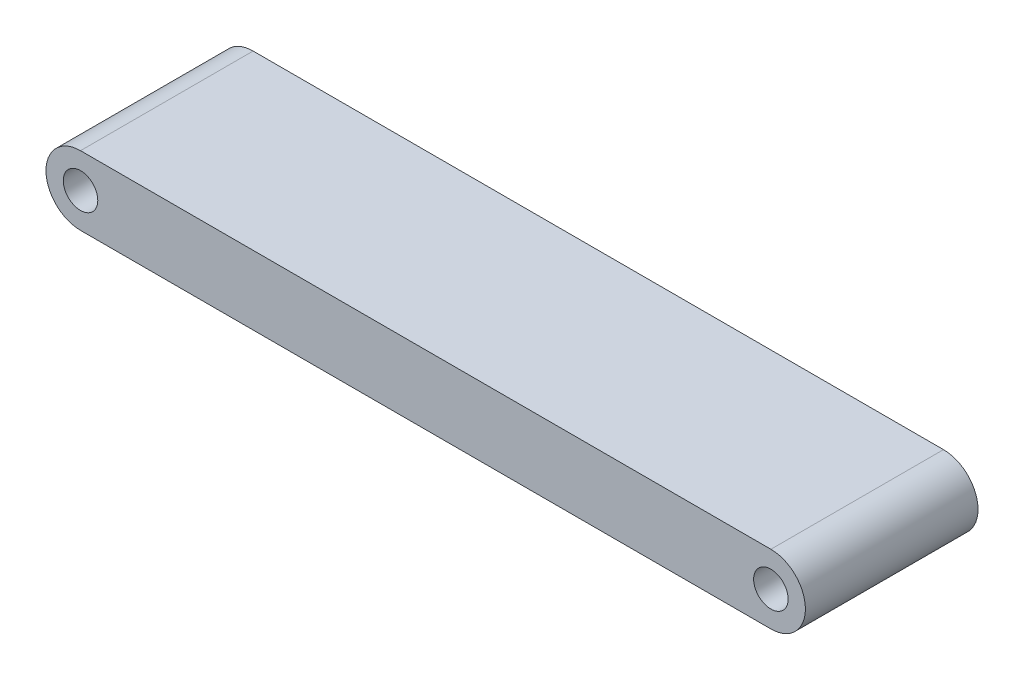
ISO-10303-21;
HEADER;
FILE_DESCRIPTION(('STEP AP214'),'2;1');
FILE_NAME('part.step','',(''),(''),'','','');
FILE_SCHEMA(('AUTOMOTIVE_DESIGN { 1 0 10303 214 1 1 1 1 }'));
ENDSEC;
DATA;
#1=APPLICATION_CONTEXT('core data for automotive mechanical design processes');
#2=APPLICATION_PROTOCOL_DEFINITION('international standard','automotive_design',2000,#1);
#3=PRODUCT_CONTEXT('',#1,'mechanical');
#4=PRODUCT('Part','Part','',(#3));
#5=PRODUCT_RELATED_PRODUCT_CATEGORY('part','',(#4));
#6=PRODUCT_DEFINITION_FORMATION('','',#4);
#7=PRODUCT_DEFINITION_CONTEXT('part definition',#1,'design');
#8=PRODUCT_DEFINITION('design','',#6,#7);
#9=PRODUCT_DEFINITION_SHAPE('','',#8);
#10=(LENGTH_UNIT() NAMED_UNIT(*) SI_UNIT(.MILLI.,.METRE.));
#11=(NAMED_UNIT(*) PLANE_ANGLE_UNIT() SI_UNIT($,.RADIAN.));
#12=(NAMED_UNIT(*) SI_UNIT($,.STERADIAN.) SOLID_ANGLE_UNIT());
#13=UNCERTAINTY_MEASURE_WITH_UNIT(LENGTH_MEASURE(1.E-05),#10,'distance_accuracy_value','');
#14=(GEOMETRIC_REPRESENTATION_CONTEXT(3) GLOBAL_UNCERTAINTY_ASSIGNED_CONTEXT((#13)) GLOBAL_UNIT_ASSIGNED_CONTEXT((#10,
#11,#12)) REPRESENTATION_CONTEXT('',''));
#15=CARTESIAN_POINT('',(0.,0.,0.));
#16=DIRECTION('',(0.,0.,1.));
#17=DIRECTION('',(1.,0.,0.));
#18=AXIS2_PLACEMENT_3D('',#15,#16,#17);
#19=CARTESIAN_POINT('',(2000.,0.,1000.));
#20=DIRECTION('',(0.,0.,-1.));
#21=DIRECTION('',(-1.,0.,0.));
#22=AXIS2_PLACEMENT_3D('',#19,#20,#21);
#23=CYLINDRICAL_SURFACE('',#22,200.);
#24=CARTESIAN_POINT('',(2000.,0.,0.));
#25=DIRECTION('',(0.,0.,1.));
#26=DIRECTION('',(1.,0.,0.));
#27=AXIS2_PLACEMENT_3D('',#24,#25,#26);
#28=CIRCLE('',#27,200.);
#29=CARTESIAN_POINT('',(2000.,-200.,0.));
#30=VERTEX_POINT('',#29);
#31=CARTESIAN_POINT('',(2000.,200.,0.));
#32=VERTEX_POINT('',#31);
#33=EDGE_CURVE('E117',#30,#32,#28,.T.);
#34=ORIENTED_EDGE('',*,*,#33,.T.);
#35=DIRECTION('',(0.,0.,-1.));
#36=VECTOR('',#35,1.);
#37=CARTESIAN_POINT('',(2000.,200.,1000.));
#38=LINE('',#37,#36);
#39=CARTESIAN_POINT('',(2000.,200.,1000.));
#40=VERTEX_POINT('',#39);
#41=EDGE_CURVE('E11',#40,#32,#38,.T.);
#42=ORIENTED_EDGE('',*,*,#41,.F.);
#43=CARTESIAN_POINT('',(2000.,0.,1000.));
#44=DIRECTION('',(0.,0.,1.));
#45=DIRECTION('',(1.,0.,0.));
#46=AXIS2_PLACEMENT_3D('',#43,#44,#45);
#47=CIRCLE('',#46,200.);
#48=CARTESIAN_POINT('',(2000.,-200.,1000.));
#49=VERTEX_POINT('',#48);
#50=EDGE_CURVE('E87',#49,#40,#47,.T.);
#51=ORIENTED_EDGE('',*,*,#50,.F.);
#52=DIRECTION('',(0.,0.,-1.));
#53=VECTOR('',#52,1.);
#54=CARTESIAN_POINT('',(2000.,-200.,1000.));
#55=LINE('',#54,#53);
#56=EDGE_CURVE('E116',#49,#30,#55,.T.);
#57=ORIENTED_EDGE('',*,*,#56,.T.);
#58=EDGE_LOOP('',(#34,#42,#51,#57));
#59=FACE_BOUND('',#58,.T.);
#60=ADVANCED_FACE('F45',(#59),#23,.T.);
#61=CARTESIAN_POINT('',(0.,200.,1000.));
#62=DIRECTION('',(0.,1.,0.));
#63=DIRECTION('',(0.,0.,1.));
#64=AXIS2_PLACEMENT_3D('',#61,#62,#63);
#65=PLANE('',#64);
#66=DIRECTION('',(1.,0.,0.));
#67=VECTOR('',#66,1.);
#68=CARTESIAN_POINT('',(0.,200.,0.));
#69=LINE('',#68,#67);
#70=CARTESIAN_POINT('',(-2000.,200.,0.));
#71=VERTEX_POINT('',#70);
#72=EDGE_CURVE('E97',#71,#32,#69,.T.);
#73=ORIENTED_EDGE('',*,*,#72,.F.);
#74=DIRECTION('',(0.,0.,-1.));
#75=VECTOR('',#74,1.);
#76=CARTESIAN_POINT('',(-2000.,200.,1000.));
#77=LINE('',#76,#75);
#78=CARTESIAN_POINT('',(-2000.,200.,1000.));
#79=VERTEX_POINT('',#78);
#80=EDGE_CURVE('E53',#79,#71,#77,.T.);
#81=ORIENTED_EDGE('',*,*,#80,.F.);
#82=DIRECTION('',(1.,0.,0.));
#83=VECTOR('',#82,1.);
#84=CARTESIAN_POINT('',(0.,200.,1000.));
#85=LINE('',#84,#83);
#86=EDGE_CURVE('E95',#79,#40,#85,.T.);
#87=ORIENTED_EDGE('',*,*,#86,.T.);
#88=ORIENTED_EDGE('',*,*,#41,.T.);
#89=EDGE_LOOP('',(#73,#81,#87,#88));
#90=FACE_BOUND('',#89,.T.);
#91=ADVANCED_FACE('F94',(#90),#65,.T.);
#92=CARTESIAN_POINT('',(-2000.,0.,1000.));
#93=DIRECTION('',(0.,0.,-1.));
#94=DIRECTION('',(-1.,0.,0.));
#95=AXIS2_PLACEMENT_3D('',#92,#93,#94);
#96=CYLINDRICAL_SURFACE('',#95,200.);
#97=CARTESIAN_POINT('',(-2000.,0.,0.));
#98=DIRECTION('',(0.,0.,1.));
#99=DIRECTION('',(1.,0.,0.));
#100=AXIS2_PLACEMENT_3D('',#97,#98,#99);
#101=CIRCLE('',#100,200.);
#102=CARTESIAN_POINT('',(-2000.,-200.,0.));
#103=VERTEX_POINT('',#102);
#104=EDGE_CURVE('E76',#71,#103,#101,.T.);
#105=ORIENTED_EDGE('',*,*,#104,.T.);
#106=DIRECTION('',(0.,0.,-1.));
#107=VECTOR('',#106,1.);
#108=CARTESIAN_POINT('',(-2000.,-200.,1000.));
#109=LINE('',#108,#107);
#110=CARTESIAN_POINT('',(-2000.,-200.,1000.));
#111=VERTEX_POINT('',#110);
#112=EDGE_CURVE('E98',#111,#103,#109,.T.);
#113=ORIENTED_EDGE('',*,*,#112,.F.);
#114=CARTESIAN_POINT('',(-2000.,0.,1000.));
#115=DIRECTION('',(0.,0.,1.));
#116=DIRECTION('',(1.,0.,0.));
#117=AXIS2_PLACEMENT_3D('',#114,#115,#116);
#118=CIRCLE('',#117,200.);
#119=EDGE_CURVE('E99',#79,#111,#118,.T.);
#120=ORIENTED_EDGE('',*,*,#119,.F.);
#121=ORIENTED_EDGE('',*,*,#80,.T.);
#122=EDGE_LOOP('',(#105,#113,#120,#121));
#123=FACE_BOUND('',#122,.T.);
#124=ADVANCED_FACE('F100',(#123),#96,.T.);
#125=CARTESIAN_POINT('',(2000.,0.,1000.));
#126=DIRECTION('',(0.,0.,-1.));
#127=DIRECTION('',(-1.,0.,0.));
#128=AXIS2_PLACEMENT_3D('',#125,#126,#127);
#129=CYLINDRICAL_SURFACE('',#128,100.);
#130=CARTESIAN_POINT('',(2000.,0.,1000.));
#131=DIRECTION('',(0.,0.,1.));
#132=DIRECTION('',(1.,0.,0.));
#133=AXIS2_PLACEMENT_3D('',#130,#131,#132);
#134=CIRCLE('',#133,100.);
#135=CARTESIAN_POINT('',(2100.,0.,1000.));
#136=VERTEX_POINT('',#135);
#137=EDGE_CURVE('E109',#136,#136,#134,.T.);
#138=ORIENTED_EDGE('',*,*,#137,.T.);
#139=EDGE_LOOP('',(#138));
#140=FACE_BOUND('',#139,.T.);
#141=CARTESIAN_POINT('',(2000.,0.,0.));
#142=DIRECTION('',(0.,0.,1.));
#143=DIRECTION('',(1.,0.,0.));
#144=AXIS2_PLACEMENT_3D('',#141,#142,#143);
#145=CIRCLE('',#144,100.);
#146=CARTESIAN_POINT('',(2100.,0.,0.));
#147=VERTEX_POINT('',#146);
#148=EDGE_CURVE('E123',#147,#147,#145,.T.);
#149=ORIENTED_EDGE('',*,*,#148,.F.);
#150=EDGE_LOOP('',(#149));
#151=FACE_BOUND('',#150,.T.);
#152=ADVANCED_FACE('F143',(#140,#151),#129,.F.);
#153=CARTESIAN_POINT('',(0.,-200.,1000.));
#154=DIRECTION('',(0.,1.,0.));
#155=DIRECTION('',(0.,0.,1.));
#156=AXIS2_PLACEMENT_3D('',#153,#154,#155);
#157=PLANE('',#156);
#158=DIRECTION('',(1.,0.,0.));
#159=VECTOR('',#158,1.);
#160=CARTESIAN_POINT('',(0.,-200.,0.));
#161=LINE('',#160,#159);
#162=EDGE_CURVE('E82',#103,#30,#161,.T.);
#163=ORIENTED_EDGE('',*,*,#162,.T.);
#164=ORIENTED_EDGE('',*,*,#56,.F.);
#165=DIRECTION('',(1.,0.,0.));
#166=VECTOR('',#165,1.);
#167=CARTESIAN_POINT('',(0.,-200.,1000.));
#168=LINE('',#167,#166);
#169=EDGE_CURVE('E61',#111,#49,#168,.T.);
#170=ORIENTED_EDGE('',*,*,#169,.F.);
#171=ORIENTED_EDGE('',*,*,#112,.T.);
#172=EDGE_LOOP('',(#163,#164,#170,#171));
#173=FACE_BOUND('',#172,.T.);
#174=ADVANCED_FACE('F130',(#173),#157,.F.);
#175=CARTESIAN_POINT('',(-2000.,0.,1000.));
#176=DIRECTION('',(0.,0.,-1.));
#177=DIRECTION('',(-1.,0.,0.));
#178=AXIS2_PLACEMENT_3D('',#175,#176,#177);
#179=CYLINDRICAL_SURFACE('',#178,100.);
#180=CARTESIAN_POINT('',(-2000.,0.,1000.));
#181=DIRECTION('',(0.,0.,1.));
#182=DIRECTION('',(1.,0.,0.));
#183=AXIS2_PLACEMENT_3D('',#180,#181,#182);
#184=CIRCLE('',#183,100.);
#185=CARTESIAN_POINT('',(-1900.,0.,1000.));
#186=VERTEX_POINT('',#185);
#187=EDGE_CURVE('E112',#186,#186,#184,.T.);
#188=ORIENTED_EDGE('',*,*,#187,.T.);
#189=EDGE_LOOP('',(#188));
#190=FACE_BOUND('',#189,.T.);
#191=CARTESIAN_POINT('',(-2000.,0.,0.));
#192=DIRECTION('',(0.,0.,1.));
#193=DIRECTION('',(1.,0.,0.));
#194=AXIS2_PLACEMENT_3D('',#191,#192,#193);
#195=CIRCLE('',#194,100.);
#196=CARTESIAN_POINT('',(-1900.,0.,0.));
#197=VERTEX_POINT('',#196);
#198=EDGE_CURVE('E105',#197,#197,#195,.T.);
#199=ORIENTED_EDGE('',*,*,#198,.F.);
#200=EDGE_LOOP('',(#199));
#201=FACE_BOUND('',#200,.T.);
#202=ADVANCED_FACE('F148',(#190,#201),#179,.F.);
#203=CARTESIAN_POINT('',(0.,0.,1000.));
#204=DIRECTION('',(0.,0.,1.));
#205=DIRECTION('',(1.,0.,0.));
#206=AXIS2_PLACEMENT_3D('',#203,#204,#205);
#207=PLANE('',#206);
#208=ORIENTED_EDGE('',*,*,#50,.T.);
#209=ORIENTED_EDGE('',*,*,#86,.F.);
#210=ORIENTED_EDGE('',*,*,#119,.T.);
#211=ORIENTED_EDGE('',*,*,#169,.T.);
#212=EDGE_LOOP('',(#208,#209,#210,#211));
#213=FACE_BOUND('',#212,.T.);
#214=ORIENTED_EDGE('',*,*,#137,.F.);
#215=EDGE_LOOP('',(#214));
#216=FACE_BOUND('',#215,.T.);
#217=ORIENTED_EDGE('',*,*,#187,.F.);
#218=EDGE_LOOP('',(#217));
#219=FACE_BOUND('',#218,.T.);
#220=ADVANCED_FACE('F102',(#213,#216,#219),#207,.T.);
#221=CARTESIAN_POINT('',(0.,0.,0.));
#222=DIRECTION('',(0.,0.,1.));
#223=DIRECTION('',(1.,0.,0.));
#224=AXIS2_PLACEMENT_3D('',#221,#222,#223);
#225=PLANE('',#224);
#226=ORIENTED_EDGE('',*,*,#33,.F.);
#227=ORIENTED_EDGE('',*,*,#162,.F.);
#228=ORIENTED_EDGE('',*,*,#104,.F.);
#229=ORIENTED_EDGE('',*,*,#72,.T.);
#230=EDGE_LOOP('',(#226,#227,#228,#229));
#231=FACE_BOUND('',#230,.T.);
#232=ORIENTED_EDGE('',*,*,#148,.T.);
#233=EDGE_LOOP('',(#232));
#234=FACE_BOUND('',#233,.T.);
#235=ORIENTED_EDGE('',*,*,#198,.T.);
#236=EDGE_LOOP('',(#235));
#237=FACE_BOUND('',#236,.T.);
#238=ADVANCED_FACE('F133',(#231,#234,#237),#225,.F.);
#239=CLOSED_SHELL('',(#60,#91,#124,#152,#174,#202,#220,#238));
#240=MANIFOLD_SOLID_BREP('B2',#239);
#241=ADVANCED_BREP_SHAPE_REPRESENTATION('',(#18,#240),#14);
#242=SHAPE_DEFINITION_REPRESENTATION(#9,#241);
ENDSEC;
END-ISO-10303-21;
